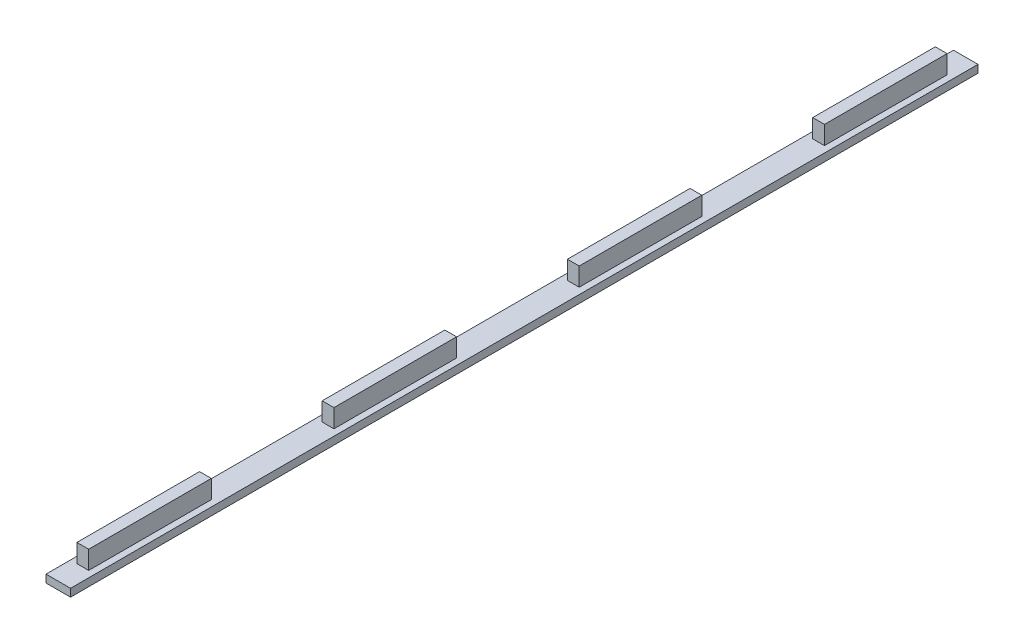
ISO-10303-21;
HEADER;
FILE_DESCRIPTION(('STEP AP214'),'2;1');
FILE_NAME('part.step','',(''),(''),'','','');
FILE_SCHEMA(('AUTOMOTIVE_DESIGN { 1 0 10303 214 1 1 1 1 }'));
ENDSEC;
DATA;
#1=APPLICATION_CONTEXT('core data for automotive mechanical design processes');
#2=APPLICATION_PROTOCOL_DEFINITION('international standard','automotive_design',2000,#1);
#3=PRODUCT_CONTEXT('',#1,'mechanical');
#4=PRODUCT('Part','Part','',(#3));
#5=PRODUCT_RELATED_PRODUCT_CATEGORY('part','',(#4));
#6=PRODUCT_DEFINITION_FORMATION('','',#4);
#7=PRODUCT_DEFINITION_CONTEXT('part definition',#1,'design');
#8=PRODUCT_DEFINITION('design','',#6,#7);
#9=PRODUCT_DEFINITION_SHAPE('','',#8);
#10=(LENGTH_UNIT() NAMED_UNIT(*) SI_UNIT(.MILLI.,.METRE.));
#11=(NAMED_UNIT(*) PLANE_ANGLE_UNIT() SI_UNIT($,.RADIAN.));
#12=(NAMED_UNIT(*) SI_UNIT($,.STERADIAN.) SOLID_ANGLE_UNIT());
#13=UNCERTAINTY_MEASURE_WITH_UNIT(LENGTH_MEASURE(1.E-05),#10,'distance_accuracy_value','');
#14=(GEOMETRIC_REPRESENTATION_CONTEXT(3) GLOBAL_UNCERTAINTY_ASSIGNED_CONTEXT((#13)) GLOBAL_UNIT_ASSIGNED_CONTEXT((#10,
#11,#12)) REPRESENTATION_CONTEXT('',''));
#15=CARTESIAN_POINT('',(0.,0.,0.));
#16=DIRECTION('',(0.,0.,1.));
#17=DIRECTION('',(1.,0.,0.));
#18=AXIS2_PLACEMENT_3D('',#15,#16,#17);
#19=CARTESIAN_POINT('',(0.,2.,0.));
#20=DIRECTION('',(0.,1.,0.));
#21=DIRECTION('',(0.,0.,1.));
#22=AXIS2_PLACEMENT_3D('',#19,#20,#21);
#23=PLANE('',#22);
#24=DIRECTION('',(1.,0.,0.));
#25=VECTOR('',#24,1.);
#26=CARTESIAN_POINT('',(0.,2.,-117.475));
#27=LINE('',#26,#25);
#28=CARTESIAN_POINT('',(-3.175,2.,-117.475));
#29=VERTEX_POINT('',#28);
#30=CARTESIAN_POINT('',(3.175,2.,-117.475));
#31=VERTEX_POINT('',#30);
#32=EDGE_CURVE('E301',#29,#31,#27,.T.);
#33=ORIENTED_EDGE('',*,*,#32,.F.);
#34=DIRECTION('',(0.,0.,1.));
#35=VECTOR('',#34,1.);
#36=CARTESIAN_POINT('',(-3.175,2.,0.));
#37=LINE('',#36,#35);
#38=CARTESIAN_POINT('',(-3.175,2.,117.475));
#39=VERTEX_POINT('',#38);
#40=EDGE_CURVE('E304',#29,#39,#37,.T.);
#41=ORIENTED_EDGE('',*,*,#40,.T.);
#42=DIRECTION('',(1.,0.,0.));
#43=VECTOR('',#42,1.);
#44=CARTESIAN_POINT('',(0.,2.,117.475));
#45=LINE('',#44,#43);
#46=CARTESIAN_POINT('',(3.175,2.,117.475));
#47=VERTEX_POINT('',#46);
#48=EDGE_CURVE('E307',#39,#47,#45,.T.);
#49=ORIENTED_EDGE('',*,*,#48,.T.);
#50=DIRECTION('',(0.,0.,1.));
#51=VECTOR('',#50,1.);
#52=CARTESIAN_POINT('',(3.175,2.,0.));
#53=LINE('',#52,#51);
#54=EDGE_CURVE('E309',#31,#47,#53,.T.);
#55=ORIENTED_EDGE('',*,*,#54,.F.);
#56=EDGE_LOOP('',(#33,#41,#49,#55));
#57=FACE_BOUND('',#56,.T.);
#58=DIRECTION('',(-1.,0.,0.));
#59=VECTOR('',#58,1.);
#60=CARTESIAN_POINT('',(0.,2.,-111.125));
#61=LINE('',#60,#59);
#62=CARTESIAN_POINT('',(1.52400000000001,2.,-111.125));
#63=VERTEX_POINT('',#62);
#64=CARTESIAN_POINT('',(-1.52399999999999,2.,-111.125));
#65=VERTEX_POINT('',#64);
#66=EDGE_CURVE('E283',#63,#65,#61,.T.);
#67=ORIENTED_EDGE('',*,*,#66,.F.);
#68=DIRECTION('',(0.,0.,-1.));
#69=VECTOR('',#68,1.);
#70=CARTESIAN_POINT('',(1.52399999999997,2.,0.));
#71=LINE('',#70,#69);
#72=CARTESIAN_POINT('',(1.524,2.,-79.375));
#73=VERTEX_POINT('',#72);
#74=EDGE_CURVE('E267',#73,#63,#71,.T.);
#75=ORIENTED_EDGE('',*,*,#74,.F.);
#76=DIRECTION('',(-1.,0.,0.));
#77=VECTOR('',#76,1.);
#78=CARTESIAN_POINT('',(0.,2.,-79.375));
#79=LINE('',#78,#77);
#80=CARTESIAN_POINT('',(-1.52399999999999,2.,-79.375));
#81=VERTEX_POINT('',#80);
#82=EDGE_CURVE('E272',#73,#81,#79,.T.);
#83=ORIENTED_EDGE('',*,*,#82,.T.);
#84=DIRECTION('',(0.,0.,-1.));
#85=VECTOR('',#84,1.);
#86=CARTESIAN_POINT('',(-1.524,2.,0.));
#87=LINE('',#86,#85);
#88=EDGE_CURVE('E286',#81,#65,#87,.T.);
#89=ORIENTED_EDGE('',*,*,#88,.T.);
#90=EDGE_LOOP('',(#67,#75,#83,#89));
#91=FACE_BOUND('',#90,.T.);
#92=DIRECTION('',(-1.,0.,0.));
#93=VECTOR('',#92,1.);
#94=CARTESIAN_POINT('',(0.,2.,-47.625));
#95=LINE('',#94,#93);
#96=CARTESIAN_POINT('',(1.52400000000067,2.,-47.625));
#97=VERTEX_POINT('',#96);
#98=CARTESIAN_POINT('',(-1.52399999999933,2.,-47.625));
#99=VERTEX_POINT('',#98);
#100=EDGE_CURVE('E250',#97,#99,#95,.T.);
#101=ORIENTED_EDGE('',*,*,#100,.F.);
#102=DIRECTION('',(0.,0.,-1.));
#103=VECTOR('',#102,1.);
#104=CARTESIAN_POINT('',(1.52400000000066,2.,0.));
#105=LINE('',#104,#103);
#106=CARTESIAN_POINT('',(1.52400000000066,2.,-15.875));
#107=VERTEX_POINT('',#106);
#108=EDGE_CURVE('E234',#107,#97,#105,.T.);
#109=ORIENTED_EDGE('',*,*,#108,.F.);
#110=DIRECTION('',(-1.,0.,0.));
#111=VECTOR('',#110,1.);
#112=CARTESIAN_POINT('',(0.,2.,-15.875));
#113=LINE('',#112,#111);
#114=CARTESIAN_POINT('',(-1.52399999999933,2.,-15.875));
#115=VERTEX_POINT('',#114);
#116=EDGE_CURVE('E239',#107,#115,#113,.T.);
#117=ORIENTED_EDGE('',*,*,#116,.T.);
#118=DIRECTION('',(0.,0.,-1.));
#119=VECTOR('',#118,1.);
#120=CARTESIAN_POINT('',(-1.52399999999933,2.,0.));
#121=LINE('',#120,#119);
#122=EDGE_CURVE('E253',#115,#99,#121,.T.);
#123=ORIENTED_EDGE('',*,*,#122,.T.);
#124=EDGE_LOOP('',(#101,#109,#117,#123));
#125=FACE_BOUND('',#124,.T.);
#126=DIRECTION('',(-1.,0.,0.));
#127=VECTOR('',#126,1.);
#128=CARTESIAN_POINT('',(0.,2.,15.875));
#129=LINE('',#128,#127);
#130=CARTESIAN_POINT('',(1.52400000000133,2.,15.875));
#131=VERTEX_POINT('',#130);
#132=CARTESIAN_POINT('',(-1.52399999999866,2.,15.875));
#133=VERTEX_POINT('',#132);
#134=EDGE_CURVE('E199',#131,#133,#129,.T.);
#135=ORIENTED_EDGE('',*,*,#134,.F.);
#136=DIRECTION('',(0.,0.,-1.));
#137=VECTOR('',#136,1.);
#138=CARTESIAN_POINT('',(1.52400000000134,2.,0.));
#139=LINE('',#138,#137);
#140=CARTESIAN_POINT('',(1.52400000000132,2.,47.625));
#141=VERTEX_POINT('',#140);
#142=EDGE_CURVE('E196',#141,#131,#139,.T.);
#143=ORIENTED_EDGE('',*,*,#142,.F.);
#144=DIRECTION('',(-1.,0.,0.));
#145=VECTOR('',#144,1.);
#146=CARTESIAN_POINT('',(0.,2.,47.625));
#147=LINE('',#146,#145);
#148=CARTESIAN_POINT('',(-1.52399999999867,2.,47.625));
#149=VERTEX_POINT('',#148);
#150=EDGE_CURVE('E209',#141,#149,#147,.T.);
#151=ORIENTED_EDGE('',*,*,#150,.T.);
#152=DIRECTION('',(0.,0.,-1.));
#153=VECTOR('',#152,1.);
#154=CARTESIAN_POINT('',(-1.52399999999866,2.,0.));
#155=LINE('',#154,#153);
#156=EDGE_CURVE('E220',#149,#133,#155,.T.);
#157=ORIENTED_EDGE('',*,*,#156,.T.);
#158=EDGE_LOOP('',(#135,#143,#151,#157));
#159=FACE_BOUND('',#158,.T.);
#160=DIRECTION('',(-1.,0.,0.));
#161=VECTOR('',#160,1.);
#162=CARTESIAN_POINT('',(0.,2.,79.375));
#163=LINE('',#162,#161);
#164=CARTESIAN_POINT('',(1.524000000002,2.,79.375));
#165=VERTEX_POINT('',#164);
#166=CARTESIAN_POINT('',(-1.523999999998,2.,79.375));
#167=VERTEX_POINT('',#166);
#168=EDGE_CURVE('E53',#165,#167,#163,.T.);
#169=ORIENTED_EDGE('',*,*,#168,.F.);
#170=DIRECTION('',(0.,0.,-1.));
#171=VECTOR('',#170,1.);
#172=CARTESIAN_POINT('',(1.52400000000203,2.,0.));
#173=LINE('',#172,#171);
#174=CARTESIAN_POINT('',(1.52400000000198,2.,111.125));
#175=VERTEX_POINT('',#174);
#176=EDGE_CURVE('E195',#175,#165,#173,.T.);
#177=ORIENTED_EDGE('',*,*,#176,.F.);
#178=DIRECTION('',(-1.,0.,0.));
#179=VECTOR('',#178,1.);
#180=CARTESIAN_POINT('',(0.,2.,111.125));
#181=LINE('',#180,#179);
#182=CARTESIAN_POINT('',(-1.52399999999801,2.,111.125));
#183=VERTEX_POINT('',#182);
#184=EDGE_CURVE('E192',#175,#183,#181,.T.);
#185=ORIENTED_EDGE('',*,*,#184,.T.);
#186=DIRECTION('',(0.,0.,-1.));
#187=VECTOR('',#186,1.);
#188=CARTESIAN_POINT('',(-1.52399999999799,2.,0.));
#189=LINE('',#188,#187);
#190=EDGE_CURVE('E58',#183,#167,#189,.T.);
#191=ORIENTED_EDGE('',*,*,#190,.T.);
#192=EDGE_LOOP('',(#169,#177,#185,#191));
#193=FACE_BOUND('',#192,.T.);
#194=ADVANCED_FACE('F38',(#57,#91,#125,#159,#193),#23,.T.);
#195=CARTESIAN_POINT('',(0.,2.,-117.475));
#196=DIRECTION('',(0.,0.,-1.));
#197=DIRECTION('',(-1.,0.,0.));
#198=AXIS2_PLACEMENT_3D('',#195,#196,#197);
#199=PLANE('',#198);
#200=DIRECTION('',(1.,0.,0.));
#201=VECTOR('',#200,1.);
#202=CARTESIAN_POINT('',(0.,0.,-117.475));
#203=LINE('',#202,#201);
#204=CARTESIAN_POINT('',(-3.175,0.,-117.475));
#205=VERTEX_POINT('',#204);
#206=CARTESIAN_POINT('',(3.175,0.,-117.475));
#207=VERTEX_POINT('',#206);
#208=EDGE_CURVE('E300',#205,#207,#203,.T.);
#209=ORIENTED_EDGE('',*,*,#208,.F.);
#210=DIRECTION('',(0.,-1.,0.));
#211=VECTOR('',#210,1.);
#212=CARTESIAN_POINT('',(-3.175,2.,-117.475));
#213=LINE('',#212,#211);
#214=EDGE_CURVE('E11',#29,#205,#213,.T.);
#215=ORIENTED_EDGE('',*,*,#214,.F.);
#216=ORIENTED_EDGE('',*,*,#32,.T.);
#217=DIRECTION('',(0.,-1.,0.));
#218=VECTOR('',#217,1.);
#219=CARTESIAN_POINT('',(3.175,2.,-117.475));
#220=LINE('',#219,#218);
#221=EDGE_CURVE('E312',#31,#207,#220,.T.);
#222=ORIENTED_EDGE('',*,*,#221,.T.);
#223=EDGE_LOOP('',(#209,#215,#216,#222));
#224=FACE_BOUND('',#223,.T.);
#225=ADVANCED_FACE('F40',(#224),#199,.T.);
#226=CARTESIAN_POINT('',(-3.175,2.,0.));
#227=DIRECTION('',(1.,0.,0.));
#228=DIRECTION('',(0.,0.,-1.));
#229=AXIS2_PLACEMENT_3D('',#226,#227,#228);
#230=PLANE('',#229);
#231=DIRECTION('',(0.,0.,1.));
#232=VECTOR('',#231,1.);
#233=CARTESIAN_POINT('',(-3.175,0.,0.));
#234=LINE('',#233,#232);
#235=CARTESIAN_POINT('',(-3.175,0.,117.475));
#236=VERTEX_POINT('',#235);
#237=EDGE_CURVE('E315',#205,#236,#234,.T.);
#238=ORIENTED_EDGE('',*,*,#237,.T.);
#239=DIRECTION('',(0.,-1.,0.));
#240=VECTOR('',#239,1.);
#241=CARTESIAN_POINT('',(-3.175,2.,117.475));
#242=LINE('',#241,#240);
#243=EDGE_CURVE('E46',#39,#236,#242,.T.);
#244=ORIENTED_EDGE('',*,*,#243,.F.);
#245=ORIENTED_EDGE('',*,*,#40,.F.);
#246=ORIENTED_EDGE('',*,*,#214,.T.);
#247=EDGE_LOOP('',(#238,#244,#245,#246));
#248=FACE_BOUND('',#247,.T.);
#249=ADVANCED_FACE('F344',(#248),#230,.F.);
#250=CARTESIAN_POINT('',(0.,2.,117.475));
#251=DIRECTION('',(0.,0.,-1.));
#252=DIRECTION('',(-1.,0.,0.));
#253=AXIS2_PLACEMENT_3D('',#250,#251,#252);
#254=PLANE('',#253);
#255=DIRECTION('',(1.,0.,0.));
#256=VECTOR('',#255,1.);
#257=CARTESIAN_POINT('',(0.,0.,117.475));
#258=LINE('',#257,#256);
#259=CARTESIAN_POINT('',(3.175,0.,117.475));
#260=VERTEX_POINT('',#259);
#261=EDGE_CURVE('E317',#236,#260,#258,.T.);
#262=ORIENTED_EDGE('',*,*,#261,.T.);
#263=DIRECTION('',(0.,-1.,0.));
#264=VECTOR('',#263,1.);
#265=CARTESIAN_POINT('',(3.175,2.,117.475));
#266=LINE('',#265,#264);
#267=EDGE_CURVE('E323',#47,#260,#266,.T.);
#268=ORIENTED_EDGE('',*,*,#267,.F.);
#269=ORIENTED_EDGE('',*,*,#48,.F.);
#270=ORIENTED_EDGE('',*,*,#243,.T.);
#271=EDGE_LOOP('',(#262,#268,#269,#270));
#272=FACE_BOUND('',#271,.T.);
#273=ADVANCED_FACE('F329',(#272),#254,.F.);
#274=CARTESIAN_POINT('',(3.175,2.,0.));
#275=DIRECTION('',(1.,0.,0.));
#276=DIRECTION('',(0.,0.,-1.));
#277=AXIS2_PLACEMENT_3D('',#274,#275,#276);
#278=PLANE('',#277);
#279=DIRECTION('',(0.,0.,1.));
#280=VECTOR('',#279,1.);
#281=CARTESIAN_POINT('',(3.175,0.,0.));
#282=LINE('',#281,#280);
#283=EDGE_CURVE('E305',#207,#260,#282,.T.);
#284=ORIENTED_EDGE('',*,*,#283,.F.);
#285=ORIENTED_EDGE('',*,*,#221,.F.);
#286=ORIENTED_EDGE('',*,*,#54,.T.);
#287=ORIENTED_EDGE('',*,*,#267,.T.);
#288=EDGE_LOOP('',(#284,#285,#286,#287));
#289=FACE_BOUND('',#288,.T.);
#290=ADVANCED_FACE('F339',(#289),#278,.T.);
#291=CARTESIAN_POINT('',(0.,0.,0.));
#292=DIRECTION('',(0.,1.,0.));
#293=DIRECTION('',(0.,0.,1.));
#294=AXIS2_PLACEMENT_3D('',#291,#292,#293);
#295=PLANE('',#294);
#296=ORIENTED_EDGE('',*,*,#208,.T.);
#297=ORIENTED_EDGE('',*,*,#283,.T.);
#298=ORIENTED_EDGE('',*,*,#261,.F.);
#299=ORIENTED_EDGE('',*,*,#237,.F.);
#300=EDGE_LOOP('',(#296,#297,#298,#299));
#301=FACE_BOUND('',#300,.T.);
#302=ADVANCED_FACE('F335',(#301),#295,.F.);
#303=CARTESIAN_POINT('',(1.52399999999997,6.7625,0.));
#304=DIRECTION('',(-1.,0.,0.));
#305=DIRECTION('',(0.,0.,1.));
#306=AXIS2_PLACEMENT_3D('',#303,#304,#305);
#307=PLANE('',#306);
#308=ORIENTED_EDGE('',*,*,#74,.T.);
#309=DIRECTION('',(0.,-1.,0.));
#310=VECTOR('',#309,1.);
#311=CARTESIAN_POINT('',(1.52400000000001,6.7625,-111.125));
#312=LINE('',#311,#310);
#313=CARTESIAN_POINT('',(1.52400000000001,6.7625,-111.125));
#314=VERTEX_POINT('',#313);
#315=EDGE_CURVE('E297',#314,#63,#312,.T.);
#316=ORIENTED_EDGE('',*,*,#315,.F.);
#317=DIRECTION('',(0.,0.,-1.));
#318=VECTOR('',#317,1.);
#319=CARTESIAN_POINT('',(1.52399999999997,6.7625,0.));
#320=LINE('',#319,#318);
#321=CARTESIAN_POINT('',(1.524,6.7625,-79.375));
#322=VERTEX_POINT('',#321);
#323=EDGE_CURVE('E268',#322,#314,#320,.T.);
#324=ORIENTED_EDGE('',*,*,#323,.F.);
#325=DIRECTION('',(0.,-1.,0.));
#326=VECTOR('',#325,1.);
#327=CARTESIAN_POINT('',(1.524,6.7625,-79.375));
#328=LINE('',#327,#326);
#329=EDGE_CURVE('E280',#322,#73,#328,.T.);
#330=ORIENTED_EDGE('',*,*,#329,.T.);
#331=EDGE_LOOP('',(#308,#316,#324,#330));
#332=FACE_BOUND('',#331,.T.);
#333=ADVANCED_FACE('F356',(#332),#307,.F.);
#334=CARTESIAN_POINT('',(0.,6.7625,-111.125));
#335=DIRECTION('',(0.,0.,1.));
#336=DIRECTION('',(1.,0.,0.));
#337=AXIS2_PLACEMENT_3D('',#334,#335,#336);
#338=PLANE('',#337);
#339=ORIENTED_EDGE('',*,*,#66,.T.);
#340=DIRECTION('',(0.,-1.,0.));
#341=VECTOR('',#340,1.);
#342=CARTESIAN_POINT('',(-1.52399999999999,6.7625,-111.125));
#343=LINE('',#342,#341);
#344=CARTESIAN_POINT('',(-1.52399999999999,6.7625,-111.125));
#345=VERTEX_POINT('',#344);
#346=EDGE_CURVE('E294',#345,#65,#343,.T.);
#347=ORIENTED_EDGE('',*,*,#346,.F.);
#348=DIRECTION('',(-1.,0.,0.));
#349=VECTOR('',#348,1.);
#350=CARTESIAN_POINT('',(0.,6.7625,-111.125));
#351=LINE('',#350,#349);
#352=EDGE_CURVE('E271',#314,#345,#351,.T.);
#353=ORIENTED_EDGE('',*,*,#352,.F.);
#354=ORIENTED_EDGE('',*,*,#315,.T.);
#355=EDGE_LOOP('',(#339,#347,#353,#354));
#356=FACE_BOUND('',#355,.T.);
#357=ADVANCED_FACE('F381',(#356),#338,.F.);
#358=CARTESIAN_POINT('',(-1.524,6.7625,0.));
#359=DIRECTION('',(-1.,0.,0.));
#360=DIRECTION('',(0.,0.,1.));
#361=AXIS2_PLACEMENT_3D('',#358,#359,#360);
#362=PLANE('',#361);
#363=ORIENTED_EDGE('',*,*,#88,.F.);
#364=DIRECTION('',(0.,-1.,0.));
#365=VECTOR('',#364,1.);
#366=CARTESIAN_POINT('',(-1.52399999999999,6.7625,-79.375));
#367=LINE('',#366,#365);
#368=CARTESIAN_POINT('',(-1.52399999999999,6.7625,-79.375));
#369=VERTEX_POINT('',#368);
#370=EDGE_CURVE('E291',#369,#81,#367,.T.);
#371=ORIENTED_EDGE('',*,*,#370,.F.);
#372=DIRECTION('',(0.,0.,-1.));
#373=VECTOR('',#372,1.);
#374=CARTESIAN_POINT('',(-1.524,6.7625,0.));
#375=LINE('',#374,#373);
#376=EDGE_CURVE('E274',#369,#345,#375,.T.);
#377=ORIENTED_EDGE('',*,*,#376,.T.);
#378=ORIENTED_EDGE('',*,*,#346,.T.);
#379=EDGE_LOOP('',(#363,#371,#377,#378));
#380=FACE_BOUND('',#379,.T.);
#381=ADVANCED_FACE('F388',(#380),#362,.T.);
#382=CARTESIAN_POINT('',(0.,6.7625,-79.375));
#383=DIRECTION('',(0.,0.,1.));
#384=DIRECTION('',(1.,0.,0.));
#385=AXIS2_PLACEMENT_3D('',#382,#383,#384);
#386=PLANE('',#385);
#387=ORIENTED_EDGE('',*,*,#82,.F.);
#388=ORIENTED_EDGE('',*,*,#329,.F.);
#389=DIRECTION('',(-1.,0.,0.));
#390=VECTOR('',#389,1.);
#391=CARTESIAN_POINT('',(0.,6.7625,-79.375));
#392=LINE('',#391,#390);
#393=EDGE_CURVE('E277',#322,#369,#392,.T.);
#394=ORIENTED_EDGE('',*,*,#393,.T.);
#395=ORIENTED_EDGE('',*,*,#370,.T.);
#396=EDGE_LOOP('',(#387,#388,#394,#395));
#397=FACE_BOUND('',#396,.T.);
#398=ADVANCED_FACE('F395',(#397),#386,.T.);
#399=CARTESIAN_POINT('',(0.,6.7625,0.));
#400=DIRECTION('',(0.,1.,0.));
#401=DIRECTION('',(0.,0.,1.));
#402=AXIS2_PLACEMENT_3D('',#399,#400,#401);
#403=PLANE('',#402);
#404=ORIENTED_EDGE('',*,*,#323,.T.);
#405=ORIENTED_EDGE('',*,*,#352,.T.);
#406=ORIENTED_EDGE('',*,*,#376,.F.);
#407=ORIENTED_EDGE('',*,*,#393,.F.);
#408=EDGE_LOOP('',(#404,#405,#406,#407));
#409=FACE_BOUND('',#408,.T.);
#410=ADVANCED_FACE('F403',(#409),#403,.T.);
#411=CARTESIAN_POINT('',(1.52400000000066,6.7625,0.));
#412=DIRECTION('',(-1.,0.,0.));
#413=DIRECTION('',(0.,0.,1.));
#414=AXIS2_PLACEMENT_3D('',#411,#412,#413);
#415=PLANE('',#414);
#416=ORIENTED_EDGE('',*,*,#108,.T.);
#417=DIRECTION('',(0.,-1.,0.));
#418=VECTOR('',#417,1.);
#419=CARTESIAN_POINT('',(1.52400000000067,6.7625,-47.625));
#420=LINE('',#419,#418);
#421=CARTESIAN_POINT('',(1.52400000000067,6.7625,-47.625));
#422=VERTEX_POINT('',#421);
#423=EDGE_CURVE('E264',#422,#97,#420,.T.);
#424=ORIENTED_EDGE('',*,*,#423,.F.);
#425=DIRECTION('',(0.,0.,-1.));
#426=VECTOR('',#425,1.);
#427=CARTESIAN_POINT('',(1.52400000000066,6.7625,0.));
#428=LINE('',#427,#426);
#429=CARTESIAN_POINT('',(1.52400000000066,6.7625,-15.875));
#430=VERTEX_POINT('',#429);
#431=EDGE_CURVE('E235',#430,#422,#428,.T.);
#432=ORIENTED_EDGE('',*,*,#431,.F.);
#433=DIRECTION('',(0.,-1.,0.));
#434=VECTOR('',#433,1.);
#435=CARTESIAN_POINT('',(1.52400000000066,6.7625,-15.875));
#436=LINE('',#435,#434);
#437=EDGE_CURVE('E247',#430,#107,#436,.T.);
#438=ORIENTED_EDGE('',*,*,#437,.T.);
#439=EDGE_LOOP('',(#416,#424,#432,#438));
#440=FACE_BOUND('',#439,.T.);
#441=ADVANCED_FACE('F411',(#440),#415,.F.);
#442=CARTESIAN_POINT('',(0.,6.7625,-47.625));
#443=DIRECTION('',(0.,0.,1.));
#444=DIRECTION('',(1.,0.,0.));
#445=AXIS2_PLACEMENT_3D('',#442,#443,#444);
#446=PLANE('',#445);
#447=ORIENTED_EDGE('',*,*,#100,.T.);
#448=DIRECTION('',(0.,-1.,0.));
#449=VECTOR('',#448,1.);
#450=CARTESIAN_POINT('',(-1.52399999999933,6.7625,-47.625));
#451=LINE('',#450,#449);
#452=CARTESIAN_POINT('',(-1.52399999999933,6.7625,-47.625));
#453=VERTEX_POINT('',#452);
#454=EDGE_CURVE('E261',#453,#99,#451,.T.);
#455=ORIENTED_EDGE('',*,*,#454,.F.);
#456=DIRECTION('',(-1.,0.,0.));
#457=VECTOR('',#456,1.);
#458=CARTESIAN_POINT('',(0.,6.7625,-47.625));
#459=LINE('',#458,#457);
#460=EDGE_CURVE('E238',#422,#453,#459,.T.);
#461=ORIENTED_EDGE('',*,*,#460,.F.);
#462=ORIENTED_EDGE('',*,*,#423,.T.);
#463=EDGE_LOOP('',(#447,#455,#461,#462));
#464=FACE_BOUND('',#463,.T.);
#465=ADVANCED_FACE('F419',(#464),#446,.F.);
#466=CARTESIAN_POINT('',(-1.52399999999933,6.7625,0.));
#467=DIRECTION('',(-1.,0.,0.));
#468=DIRECTION('',(0.,0.,1.));
#469=AXIS2_PLACEMENT_3D('',#466,#467,#468);
#470=PLANE('',#469);
#471=ORIENTED_EDGE('',*,*,#122,.F.);
#472=DIRECTION('',(0.,-1.,0.));
#473=VECTOR('',#472,1.);
#474=CARTESIAN_POINT('',(-1.52399999999933,6.7625,-15.875));
#475=LINE('',#474,#473);
#476=CARTESIAN_POINT('',(-1.52399999999933,6.7625,-15.875));
#477=VERTEX_POINT('',#476);
#478=EDGE_CURVE('E258',#477,#115,#475,.T.);
#479=ORIENTED_EDGE('',*,*,#478,.F.);
#480=DIRECTION('',(0.,0.,-1.));
#481=VECTOR('',#480,1.);
#482=CARTESIAN_POINT('',(-1.52399999999933,6.7625,0.));
#483=LINE('',#482,#481);
#484=EDGE_CURVE('E241',#477,#453,#483,.T.);
#485=ORIENTED_EDGE('',*,*,#484,.T.);
#486=ORIENTED_EDGE('',*,*,#454,.T.);
#487=EDGE_LOOP('',(#471,#479,#485,#486));
#488=FACE_BOUND('',#487,.T.);
#489=ADVANCED_FACE('F427',(#488),#470,.T.);
#490=CARTESIAN_POINT('',(0.,6.7625,-15.875));
#491=DIRECTION('',(0.,0.,1.));
#492=DIRECTION('',(1.,0.,0.));
#493=AXIS2_PLACEMENT_3D('',#490,#491,#492);
#494=PLANE('',#493);
#495=ORIENTED_EDGE('',*,*,#116,.F.);
#496=ORIENTED_EDGE('',*,*,#437,.F.);
#497=DIRECTION('',(-1.,0.,0.));
#498=VECTOR('',#497,1.);
#499=CARTESIAN_POINT('',(0.,6.7625,-15.875));
#500=LINE('',#499,#498);
#501=EDGE_CURVE('E244',#430,#477,#500,.T.);
#502=ORIENTED_EDGE('',*,*,#501,.T.);
#503=ORIENTED_EDGE('',*,*,#478,.T.);
#504=EDGE_LOOP('',(#495,#496,#502,#503));
#505=FACE_BOUND('',#504,.T.);
#506=ADVANCED_FACE('F435',(#505),#494,.T.);
#507=CARTESIAN_POINT('',(0.,6.7625,0.));
#508=DIRECTION('',(0.,1.,0.));
#509=DIRECTION('',(0.,0.,1.));
#510=AXIS2_PLACEMENT_3D('',#507,#508,#509);
#511=PLANE('',#510);
#512=ORIENTED_EDGE('',*,*,#431,.T.);
#513=ORIENTED_EDGE('',*,*,#460,.T.);
#514=ORIENTED_EDGE('',*,*,#484,.F.);
#515=ORIENTED_EDGE('',*,*,#501,.F.);
#516=EDGE_LOOP('',(#512,#513,#514,#515));
#517=FACE_BOUND('',#516,.T.);
#518=ADVANCED_FACE('F443',(#517),#511,.T.);
#519=CARTESIAN_POINT('',(1.52400000000134,6.7625,0.));
#520=DIRECTION('',(-1.,0.,0.));
#521=DIRECTION('',(0.,0.,1.));
#522=AXIS2_PLACEMENT_3D('',#519,#520,#521);
#523=PLANE('',#522);
#524=ORIENTED_EDGE('',*,*,#142,.T.);
#525=DIRECTION('',(0.,-1.,0.));
#526=VECTOR('',#525,1.);
#527=CARTESIAN_POINT('',(1.52400000000133,6.7625,15.875));
#528=LINE('',#527,#526);
#529=CARTESIAN_POINT('',(1.52400000000133,6.7625,15.875));
#530=VERTEX_POINT('',#529);
#531=EDGE_CURVE('E231',#530,#131,#528,.T.);
#532=ORIENTED_EDGE('',*,*,#531,.F.);
#533=DIRECTION('',(0.,0.,-1.));
#534=VECTOR('',#533,1.);
#535=CARTESIAN_POINT('',(1.52400000000134,6.7625,0.));
#536=LINE('',#535,#534);
#537=CARTESIAN_POINT('',(1.52400000000132,6.7625,47.625));
#538=VERTEX_POINT('',#537);
#539=EDGE_CURVE('E205',#538,#530,#536,.T.);
#540=ORIENTED_EDGE('',*,*,#539,.F.);
#541=DIRECTION('',(0.,-1.,0.));
#542=VECTOR('',#541,1.);
#543=CARTESIAN_POINT('',(1.52400000000132,6.7625,47.625));
#544=LINE('',#543,#542);
#545=EDGE_CURVE('E216',#538,#141,#544,.T.);
#546=ORIENTED_EDGE('',*,*,#545,.T.);
#547=EDGE_LOOP('',(#524,#532,#540,#546));
#548=FACE_BOUND('',#547,.T.);
#549=ADVANCED_FACE('F451',(#548),#523,.F.);
#550=CARTESIAN_POINT('',(0.,6.7625,15.875));
#551=DIRECTION('',(0.,0.,1.));
#552=DIRECTION('',(1.,0.,0.));
#553=AXIS2_PLACEMENT_3D('',#550,#551,#552);
#554=PLANE('',#553);
#555=ORIENTED_EDGE('',*,*,#134,.T.);
#556=DIRECTION('',(0.,-1.,0.));
#557=VECTOR('',#556,1.);
#558=CARTESIAN_POINT('',(-1.52399999999866,6.7625,15.875));
#559=LINE('',#558,#557);
#560=CARTESIAN_POINT('',(-1.52399999999866,6.7625,15.875));
#561=VERTEX_POINT('',#560);
#562=EDGE_CURVE('E228',#561,#133,#559,.T.);
#563=ORIENTED_EDGE('',*,*,#562,.F.);
#564=DIRECTION('',(-1.,0.,0.));
#565=VECTOR('',#564,1.);
#566=CARTESIAN_POINT('',(0.,6.7625,15.875));
#567=LINE('',#566,#565);
#568=EDGE_CURVE('E208',#530,#561,#567,.T.);
#569=ORIENTED_EDGE('',*,*,#568,.F.);
#570=ORIENTED_EDGE('',*,*,#531,.T.);
#571=EDGE_LOOP('',(#555,#563,#569,#570));
#572=FACE_BOUND('',#571,.T.);
#573=ADVANCED_FACE('F459',(#572),#554,.F.);
#574=CARTESIAN_POINT('',(-1.52399999999866,6.7625,0.));
#575=DIRECTION('',(-1.,0.,0.));
#576=DIRECTION('',(0.,0.,1.));
#577=AXIS2_PLACEMENT_3D('',#574,#575,#576);
#578=PLANE('',#577);
#579=ORIENTED_EDGE('',*,*,#156,.F.);
#580=DIRECTION('',(0.,-1.,0.));
#581=VECTOR('',#580,1.);
#582=CARTESIAN_POINT('',(-1.52399999999867,6.7625,47.625));
#583=LINE('',#582,#581);
#584=CARTESIAN_POINT('',(-1.52399999999867,6.7625,47.625));
#585=VERTEX_POINT('',#584);
#586=EDGE_CURVE('E225',#585,#149,#583,.T.);
#587=ORIENTED_EDGE('',*,*,#586,.F.);
#588=DIRECTION('',(0.,0.,-1.));
#589=VECTOR('',#588,1.);
#590=CARTESIAN_POINT('',(-1.52399999999866,6.7625,0.));
#591=LINE('',#590,#589);
#592=EDGE_CURVE('E211',#585,#561,#591,.T.);
#593=ORIENTED_EDGE('',*,*,#592,.T.);
#594=ORIENTED_EDGE('',*,*,#562,.T.);
#595=EDGE_LOOP('',(#579,#587,#593,#594));
#596=FACE_BOUND('',#595,.T.);
#597=ADVANCED_FACE('F467',(#596),#578,.T.);
#598=CARTESIAN_POINT('',(0.,6.7625,47.625));
#599=DIRECTION('',(0.,0.,1.));
#600=DIRECTION('',(1.,0.,0.));
#601=AXIS2_PLACEMENT_3D('',#598,#599,#600);
#602=PLANE('',#601);
#603=ORIENTED_EDGE('',*,*,#150,.F.);
#604=ORIENTED_EDGE('',*,*,#545,.F.);
#605=DIRECTION('',(-1.,0.,0.));
#606=VECTOR('',#605,1.);
#607=CARTESIAN_POINT('',(0.,6.7625,47.625));
#608=LINE('',#607,#606);
#609=EDGE_CURVE('E214',#538,#585,#608,.T.);
#610=ORIENTED_EDGE('',*,*,#609,.T.);
#611=ORIENTED_EDGE('',*,*,#586,.T.);
#612=EDGE_LOOP('',(#603,#604,#610,#611));
#613=FACE_BOUND('',#612,.T.);
#614=ADVANCED_FACE('F475',(#613),#602,.T.);
#615=CARTESIAN_POINT('',(0.,6.7625,0.));
#616=DIRECTION('',(0.,1.,0.));
#617=DIRECTION('',(0.,0.,1.));
#618=AXIS2_PLACEMENT_3D('',#615,#616,#617);
#619=PLANE('',#618);
#620=ORIENTED_EDGE('',*,*,#539,.T.);
#621=ORIENTED_EDGE('',*,*,#568,.T.);
#622=ORIENTED_EDGE('',*,*,#592,.F.);
#623=ORIENTED_EDGE('',*,*,#609,.F.);
#624=EDGE_LOOP('',(#620,#621,#622,#623));
#625=FACE_BOUND('',#624,.T.);
#626=ADVANCED_FACE('F483',(#625),#619,.T.);
#627=CARTESIAN_POINT('',(1.52400000000203,6.7625,0.));
#628=DIRECTION('',(-1.,0.,0.));
#629=DIRECTION('',(0.,0.,1.));
#630=AXIS2_PLACEMENT_3D('',#627,#628,#629);
#631=PLANE('',#630);
#632=ORIENTED_EDGE('',*,*,#176,.T.);
#633=DIRECTION('',(0.,-1.,0.));
#634=VECTOR('',#633,1.);
#635=CARTESIAN_POINT('',(1.524000000002,6.7625,79.375));
#636=LINE('',#635,#634);
#637=CARTESIAN_POINT('',(1.524000000002,6.7625,79.375));
#638=VERTEX_POINT('',#637);
#639=EDGE_CURVE('E176',#638,#165,#636,.T.);
#640=ORIENTED_EDGE('',*,*,#639,.F.);
#641=DIRECTION('',(0.,0.,-1.));
#642=VECTOR('',#641,1.);
#643=CARTESIAN_POINT('',(1.52400000000203,6.7625,0.));
#644=LINE('',#643,#642);
#645=CARTESIAN_POINT('',(1.52400000000198,6.7625,111.125));
#646=VERTEX_POINT('',#645);
#647=EDGE_CURVE('E183',#646,#638,#644,.T.);
#648=ORIENTED_EDGE('',*,*,#647,.F.);
#649=DIRECTION('',(0.,-1.,0.));
#650=VECTOR('',#649,1.);
#651=CARTESIAN_POINT('',(1.52400000000198,6.7625,111.125));
#652=LINE('',#651,#650);
#653=EDGE_CURVE('E606',#646,#175,#652,.T.);
#654=ORIENTED_EDGE('',*,*,#653,.T.);
#655=EDGE_LOOP('',(#632,#640,#648,#654));
#656=FACE_BOUND('',#655,.T.);
#657=ADVANCED_FACE('F194',(#656),#631,.F.);
#658=CARTESIAN_POINT('',(0.,6.7625,79.375));
#659=DIRECTION('',(0.,0.,1.));
#660=DIRECTION('',(1.,0.,0.));
#661=AXIS2_PLACEMENT_3D('',#658,#659,#660);
#662=PLANE('',#661);
#663=ORIENTED_EDGE('',*,*,#168,.T.);
#664=DIRECTION('',(0.,-1.,0.));
#665=VECTOR('',#664,1.);
#666=CARTESIAN_POINT('',(-1.523999999998,6.7625,79.375));
#667=LINE('',#666,#665);
#668=CARTESIAN_POINT('',(-1.523999999998,6.7625,79.375));
#669=VERTEX_POINT('',#668);
#670=EDGE_CURVE('E178',#669,#167,#667,.T.);
#671=ORIENTED_EDGE('',*,*,#670,.F.);
#672=DIRECTION('',(-1.,0.,0.));
#673=VECTOR('',#672,1.);
#674=CARTESIAN_POINT('',(0.,6.7625,79.375));
#675=LINE('',#674,#673);
#676=EDGE_CURVE('E172',#638,#669,#675,.T.);
#677=ORIENTED_EDGE('',*,*,#676,.F.);
#678=ORIENTED_EDGE('',*,*,#639,.T.);
#679=EDGE_LOOP('',(#663,#671,#677,#678));
#680=FACE_BOUND('',#679,.T.);
#681=ADVANCED_FACE('F174',(#680),#662,.F.);
#682=CARTESIAN_POINT('',(-1.52399999999799,6.7625,0.));
#683=DIRECTION('',(-1.,0.,0.));
#684=DIRECTION('',(0.,0.,1.));
#685=AXIS2_PLACEMENT_3D('',#682,#683,#684);
#686=PLANE('',#685);
#687=ORIENTED_EDGE('',*,*,#190,.F.);
#688=DIRECTION('',(0.,-1.,0.));
#689=VECTOR('',#688,1.);
#690=CARTESIAN_POINT('',(-1.52399999999801,6.7625,111.125));
#691=LINE('',#690,#689);
#692=CARTESIAN_POINT('',(-1.52399999999801,6.7625,111.125));
#693=VERTEX_POINT('',#692);
#694=EDGE_CURVE('E201',#693,#183,#691,.T.);
#695=ORIENTED_EDGE('',*,*,#694,.F.);
#696=DIRECTION('',(0.,0.,-1.));
#697=VECTOR('',#696,1.);
#698=CARTESIAN_POINT('',(-1.52399999999799,6.7625,0.));
#699=LINE('',#698,#697);
#700=EDGE_CURVE('E182',#693,#669,#699,.T.);
#701=ORIENTED_EDGE('',*,*,#700,.T.);
#702=ORIENTED_EDGE('',*,*,#670,.T.);
#703=EDGE_LOOP('',(#687,#695,#701,#702));
#704=FACE_BOUND('',#703,.T.);
#705=ADVANCED_FACE('F504',(#704),#686,.T.);
#706=CARTESIAN_POINT('',(0.,6.7625,111.125));
#707=DIRECTION('',(0.,0.,1.));
#708=DIRECTION('',(1.,0.,0.));
#709=AXIS2_PLACEMENT_3D('',#706,#707,#708);
#710=PLANE('',#709);
#711=ORIENTED_EDGE('',*,*,#184,.F.);
#712=ORIENTED_EDGE('',*,*,#653,.F.);
#713=DIRECTION('',(-1.,0.,0.));
#714=VECTOR('',#713,1.);
#715=CARTESIAN_POINT('',(0.,6.7625,111.125));
#716=LINE('',#715,#714);
#717=EDGE_CURVE('E189',#646,#693,#716,.T.);
#718=ORIENTED_EDGE('',*,*,#717,.T.);
#719=ORIENTED_EDGE('',*,*,#694,.T.);
#720=EDGE_LOOP('',(#711,#712,#718,#719));
#721=FACE_BOUND('',#720,.T.);
#722=ADVANCED_FACE('F511',(#721),#710,.T.);
#723=CARTESIAN_POINT('',(0.,6.7625,0.));
#724=DIRECTION('',(0.,1.,0.));
#725=DIRECTION('',(0.,0.,1.));
#726=AXIS2_PLACEMENT_3D('',#723,#724,#725);
#727=PLANE('',#726);
#728=ORIENTED_EDGE('',*,*,#647,.T.);
#729=ORIENTED_EDGE('',*,*,#676,.T.);
#730=ORIENTED_EDGE('',*,*,#700,.F.);
#731=ORIENTED_EDGE('',*,*,#717,.F.);
#732=EDGE_LOOP('',(#728,#729,#730,#731));
#733=FACE_BOUND('',#732,.T.);
#734=ADVANCED_FACE('F187',(#733),#727,.T.);
#735=CLOSED_SHELL('',(#194,#225,#249,#273,#290,#302,#333,#357,#381,#398,#410,#441,#465,#489,
#506,#518,#549,#573,#597,#614,#626,#657,#681,#705,#722,#734));
#736=MANIFOLD_SOLID_BREP('B2',#735);
#737=ADVANCED_BREP_SHAPE_REPRESENTATION('',(#18,#736),#14);
#738=SHAPE_DEFINITION_REPRESENTATION(#9,#737);
ENDSEC;
END-ISO-10303-21;
